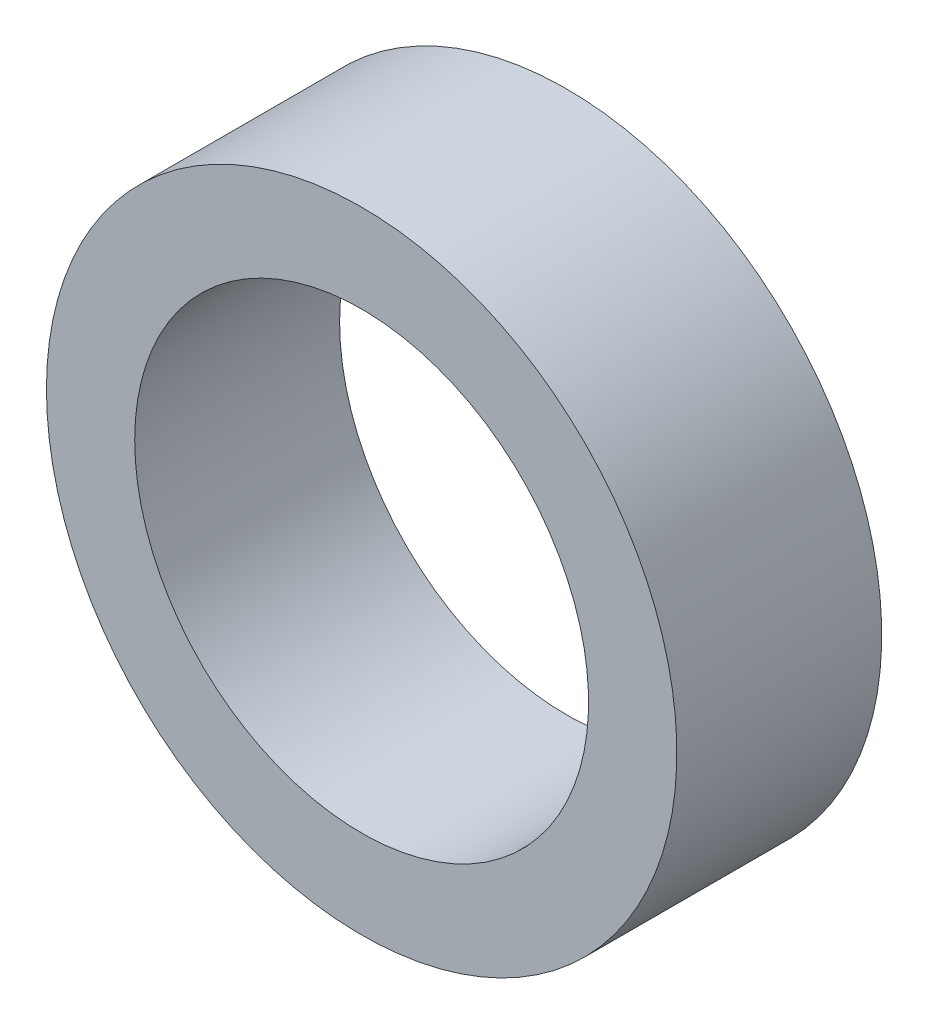
ISO-10303-21;
HEADER;
FILE_DESCRIPTION(('STEP AP214'),'2;1');
FILE_NAME('part.step','',(''),(''),'','','');
FILE_SCHEMA(('AUTOMOTIVE_DESIGN { 1 0 10303 214 1 1 1 1 }'));
ENDSEC;
DATA;
#1=APPLICATION_CONTEXT('core data for automotive mechanical design processes');
#2=APPLICATION_PROTOCOL_DEFINITION('international standard','automotive_design',2000,#1);
#3=PRODUCT_CONTEXT('',#1,'mechanical');
#4=PRODUCT('Part','Part','',(#3));
#5=PRODUCT_RELATED_PRODUCT_CATEGORY('part','',(#4));
#6=PRODUCT_DEFINITION_FORMATION('','',#4);
#7=PRODUCT_DEFINITION_CONTEXT('part definition',#1,'design');
#8=PRODUCT_DEFINITION('design','',#6,#7);
#9=PRODUCT_DEFINITION_SHAPE('','',#8);
#10=(LENGTH_UNIT() NAMED_UNIT(*) SI_UNIT(.MILLI.,.METRE.));
#11=(NAMED_UNIT(*) PLANE_ANGLE_UNIT() SI_UNIT($,.RADIAN.));
#12=(NAMED_UNIT(*) SI_UNIT($,.STERADIAN.) SOLID_ANGLE_UNIT());
#13=UNCERTAINTY_MEASURE_WITH_UNIT(LENGTH_MEASURE(1.E-05),#10,'distance_accuracy_value','');
#14=(GEOMETRIC_REPRESENTATION_CONTEXT(3) GLOBAL_UNCERTAINTY_ASSIGNED_CONTEXT((#13)) GLOBAL_UNIT_ASSIGNED_CONTEXT((#10,
#11,#12)) REPRESENTATION_CONTEXT('',''));
#15=CARTESIAN_POINT('',(0.,0.,0.));
#16=DIRECTION('',(0.,0.,1.));
#17=DIRECTION('',(1.,0.,0.));
#18=AXIS2_PLACEMENT_3D('',#15,#16,#17);
#19=CARTESIAN_POINT('',(0.,0.,1.625));
#20=DIRECTION('',(0.,0.,1.));
#21=DIRECTION('',(1.,0.,0.));
#22=AXIS2_PLACEMENT_3D('',#19,#20,#21);
#23=PLANE('',#22);
#24=CARTESIAN_POINT('',(0.,0.,1.625));
#25=DIRECTION('',(0.,0.,1.));
#26=DIRECTION('',(1.,0.,0.));
#27=AXIS2_PLACEMENT_3D('',#24,#25,#26);
#28=CIRCLE('',#27,5.);
#29=CARTESIAN_POINT('',(-5.,0.,1.625));
#30=VERTEX_POINT('',#29);
#31=EDGE_CURVE('E10',#30,#30,#28,.T.);
#32=ORIENTED_EDGE('',*,*,#31,.T.);
#33=EDGE_LOOP('',(#32));
#34=FACE_BOUND('',#33,.T.);
#35=CARTESIAN_POINT('',(0.,0.,1.625));
#36=DIRECTION('',(0.,0.,1.));
#37=DIRECTION('',(1.,0.,0.));
#38=AXIS2_PLACEMENT_3D('',#35,#36,#37);
#39=CIRCLE('',#38,3.6);
#40=CARTESIAN_POINT('',(-3.6,0.,1.625));
#41=VERTEX_POINT('',#40);
#42=EDGE_CURVE('E54',#41,#41,#39,.T.);
#43=ORIENTED_EDGE('',*,*,#42,.F.);
#44=EDGE_LOOP('',(#43));
#45=FACE_BOUND('',#44,.T.);
#46=ADVANCED_FACE('F41',(#34,#45),#23,.T.);
#47=CARTESIAN_POINT('',(0.,0.,-1.625));
#48=DIRECTION('',(0.,0.,1.));
#49=DIRECTION('',(1.,0.,0.));
#50=AXIS2_PLACEMENT_3D('',#47,#48,#49);
#51=PLANE('',#50);
#52=CARTESIAN_POINT('',(0.,0.,-1.625));
#53=DIRECTION('',(0.,0.,1.));
#54=DIRECTION('',(1.,0.,0.));
#55=AXIS2_PLACEMENT_3D('',#52,#53,#54);
#56=CIRCLE('',#55,5.);
#57=CARTESIAN_POINT('',(-5.,0.,-1.625));
#58=VERTEX_POINT('',#57);
#59=EDGE_CURVE('E45',#58,#58,#56,.T.);
#60=ORIENTED_EDGE('',*,*,#59,.F.);
#61=EDGE_LOOP('',(#60));
#62=FACE_BOUND('',#61,.T.);
#63=CARTESIAN_POINT('',(0.,0.,-1.625));
#64=DIRECTION('',(0.,0.,1.));
#65=DIRECTION('',(1.,0.,0.));
#66=AXIS2_PLACEMENT_3D('',#63,#64,#65);
#67=CIRCLE('',#66,3.6);
#68=CARTESIAN_POINT('',(-3.6,0.,-1.625));
#69=VERTEX_POINT('',#68);
#70=EDGE_CURVE('E56',#69,#69,#67,.T.);
#71=ORIENTED_EDGE('',*,*,#70,.T.);
#72=EDGE_LOOP('',(#71));
#73=FACE_BOUND('',#72,.T.);
#74=ADVANCED_FACE('F68',(#62,#73),#51,.F.);
#75=CARTESIAN_POINT('',(0.,0.,1.625));
#76=DIRECTION('',(0.,0.,-1.));
#77=DIRECTION('',(-1.,0.,0.));
#78=AXIS2_PLACEMENT_3D('',#75,#76,#77);
#79=CYLINDRICAL_SURFACE('',#78,5.);
#80=CARTESIAN_POINT('',(-5.,0.,1.625));
#81=CARTESIAN_POINT('',(-5.,0.,1.59114583333333));
#82=CARTESIAN_POINT('',(-5.,0.,1.55729166666667));
#83=CARTESIAN_POINT('',(-5.,0.,1.48958333333333));
#84=CARTESIAN_POINT('',(-5.,0.,1.45572916666667));
#85=CARTESIAN_POINT('',(-5.,0.,1.38802083333333));
#86=CARTESIAN_POINT('',(-5.,0.,1.35416666666667));
#87=CARTESIAN_POINT('',(-5.,0.,1.28645833333333));
#88=CARTESIAN_POINT('',(-5.,0.,1.25260416666667));
#89=CARTESIAN_POINT('',(-5.,0.,1.18489583333333));
#90=CARTESIAN_POINT('',(-5.,0.,1.15104166666667));
#91=CARTESIAN_POINT('',(-5.,0.,1.08333333333333));
#92=CARTESIAN_POINT('',(-5.,0.,1.04947916666667));
#93=CARTESIAN_POINT('',(-5.,0.,0.981770833333333));
#94=CARTESIAN_POINT('',(-5.,0.,0.947916666666666));
#95=CARTESIAN_POINT('',(-5.,0.,0.880208333333333));
#96=CARTESIAN_POINT('',(-5.,0.,0.846354166666667));
#97=CARTESIAN_POINT('',(-5.,0.,0.778645833333333));
#98=CARTESIAN_POINT('',(-5.,0.,0.744791666666667));
#99=CARTESIAN_POINT('',(-5.,0.,0.677083333333333));
#100=CARTESIAN_POINT('',(-5.,0.,0.643229166666667));
#101=CARTESIAN_POINT('',(-5.,0.,0.575520833333333));
#102=CARTESIAN_POINT('',(-5.,0.,0.541666666666666));
#103=CARTESIAN_POINT('',(-5.,0.,0.473958333333333));
#104=CARTESIAN_POINT('',(-5.,0.,0.440104166666666));
#105=CARTESIAN_POINT('',(-5.,0.,0.372395833333333));
#106=CARTESIAN_POINT('',(-5.,0.,0.338541666666666));
#107=CARTESIAN_POINT('',(-5.,0.,0.270833333333333));
#108=CARTESIAN_POINT('',(-5.,0.,0.236979166666666));
#109=CARTESIAN_POINT('',(-5.,0.,0.169270833333333));
#110=CARTESIAN_POINT('',(-5.,0.,0.135416666666666));
#111=CARTESIAN_POINT('',(-5.,0.,0.0677083333333332));
#112=CARTESIAN_POINT('',(-5.,0.,0.0338541666666665));
#113=CARTESIAN_POINT('',(-5.,0.,-0.0338541666666669));
#114=CARTESIAN_POINT('',(-5.,0.,-0.0677083333333336));
#115=CARTESIAN_POINT('',(-5.,0.,-0.135416666666667));
#116=CARTESIAN_POINT('',(-5.,0.,-0.169270833333334));
#117=CARTESIAN_POINT('',(-5.,0.,-0.236979166666667));
#118=CARTESIAN_POINT('',(-5.,0.,-0.270833333333334));
#119=CARTESIAN_POINT('',(-5.,0.,-0.338541666666667));
#120=CARTESIAN_POINT('',(-5.,0.,-0.372395833333333));
#121=CARTESIAN_POINT('',(-5.,0.,-0.440104166666666));
#122=CARTESIAN_POINT('',(-5.,0.,-0.473958333333333));
#123=CARTESIAN_POINT('',(-5.,0.,-0.541666666666667));
#124=CARTESIAN_POINT('',(-5.,0.,-0.575520833333333));
#125=CARTESIAN_POINT('',(-5.,0.,-0.643229166666667));
#126=CARTESIAN_POINT('',(-5.,0.,-0.677083333333333));
#127=CARTESIAN_POINT('',(-5.,0.,-0.744791666666667));
#128=CARTESIAN_POINT('',(-5.,0.,-0.778645833333333));
#129=CARTESIAN_POINT('',(-5.,0.,-0.846354166666667));
#130=CARTESIAN_POINT('',(-5.,0.,-0.880208333333333));
#131=CARTESIAN_POINT('',(-5.,0.,-0.947916666666666));
#132=CARTESIAN_POINT('',(-5.,0.,-0.981770833333333));
#133=CARTESIAN_POINT('',(-5.,0.,-1.04947916666667));
#134=CARTESIAN_POINT('',(-5.,0.,-1.08333333333333));
#135=CARTESIAN_POINT('',(-5.,0.,-1.15104166666667));
#136=CARTESIAN_POINT('',(-5.,0.,-1.18489583333333));
#137=CARTESIAN_POINT('',(-5.,0.,-1.25260416666667));
#138=CARTESIAN_POINT('',(-5.,0.,-1.28645833333333));
#139=CARTESIAN_POINT('',(-5.,0.,-1.35416666666667));
#140=CARTESIAN_POINT('',(-5.,0.,-1.38802083333333));
#141=CARTESIAN_POINT('',(-5.,0.,-1.45572916666667));
#142=CARTESIAN_POINT('',(-5.,0.,-1.48958333333333));
#143=CARTESIAN_POINT('',(-5.,0.,-1.55729166666667));
#144=CARTESIAN_POINT('',(-5.,0.,-1.59114583333333));
#145=CARTESIAN_POINT('',(-5.,0.,-1.625));
#146=B_SPLINE_CURVE_WITH_KNOTS('',3,(#80,#81,#82,#83,#84,#85,#86,#87,#88,#89,#90,#91,#92,#93,
#94,#95,#96,#97,#98,#99,#100,#101,#102,#103,#104,#105,#106,#107,#108,#109,#110,#111,#112,#113,
#114,#115,#116,#117,#118,#119,#120,#121,#122,#123,#124,#125,#126,#127,#128,#129,#130,#131,#132,
#133,#134,#135,#136,#137,#138,#139,#140,#141,#142,#143,#144,#145),.UNSPECIFIED.,.F.,.F.,(4,2,2,
2,2,2,2,2,2,2,2,2,2,2,2,2,2,2,2,2,2,2,2,2,2,2,2,2,2,2,2,2,4),(0.,0.1015625,0.203125,0.3046875,
0.40625,0.5078125,0.609375,0.7109375,0.8125,0.9140625,1.015625,1.1171875,1.21875,1.3203125,
1.421875,1.5234375,1.625,1.7265625,1.828125,1.9296875,2.03125,2.1328125,2.234375,2.3359375,
2.4375,2.5390625,2.640625,2.7421875,2.84375,2.9453125,3.046875,3.1484375,3.25),.UNSPECIFIED.);
#147=EDGE_CURVE('BSEAM43',#30,#58,#146,.T.);
#148=ORIENTED_EDGE('',*,*,#31,.F.);
#149=ORIENTED_EDGE('',*,*,#59,.T.);
#150=ORIENTED_EDGE('',*,*,#147,.T.);
#151=ORIENTED_EDGE('',*,*,#147,.F.);
#152=EDGE_LOOP('',(#148,#150,#149,#151));
#153=FACE_BOUND('',#152,.T.);
#154=ADVANCED_FACE('F43',(#153),#79,.T.);
#155=CARTESIAN_POINT('',(0.,0.,1.625));
#156=DIRECTION('',(0.,0.,-1.));
#157=DIRECTION('',(-1.,0.,0.));
#158=AXIS2_PLACEMENT_3D('',#155,#156,#157);
#159=CYLINDRICAL_SURFACE('',#158,3.6);
#160=CARTESIAN_POINT('',(-3.6,0.,1.625));
#161=CARTESIAN_POINT('',(-3.6,0.,1.59114583333333));
#162=CARTESIAN_POINT('',(-3.6,0.,1.55729166666667));
#163=CARTESIAN_POINT('',(-3.6,0.,1.48958333333333));
#164=CARTESIAN_POINT('',(-3.6,0.,1.45572916666667));
#165=CARTESIAN_POINT('',(-3.6,0.,1.38802083333333));
#166=CARTESIAN_POINT('',(-3.6,0.,1.35416666666667));
#167=CARTESIAN_POINT('',(-3.6,0.,1.28645833333333));
#168=CARTESIAN_POINT('',(-3.6,0.,1.25260416666667));
#169=CARTESIAN_POINT('',(-3.6,0.,1.18489583333333));
#170=CARTESIAN_POINT('',(-3.6,0.,1.15104166666667));
#171=CARTESIAN_POINT('',(-3.6,0.,1.08333333333333));
#172=CARTESIAN_POINT('',(-3.6,0.,1.04947916666667));
#173=CARTESIAN_POINT('',(-3.6,0.,0.981770833333333));
#174=CARTESIAN_POINT('',(-3.6,0.,0.947916666666666));
#175=CARTESIAN_POINT('',(-3.6,0.,0.880208333333333));
#176=CARTESIAN_POINT('',(-3.6,0.,0.846354166666667));
#177=CARTESIAN_POINT('',(-3.6,0.,0.778645833333333));
#178=CARTESIAN_POINT('',(-3.6,0.,0.744791666666667));
#179=CARTESIAN_POINT('',(-3.6,0.,0.677083333333333));
#180=CARTESIAN_POINT('',(-3.6,0.,0.643229166666667));
#181=CARTESIAN_POINT('',(-3.6,0.,0.575520833333333));
#182=CARTESIAN_POINT('',(-3.6,0.,0.541666666666667));
#183=CARTESIAN_POINT('',(-3.6,0.,0.473958333333333));
#184=CARTESIAN_POINT('',(-3.6,0.,0.440104166666667));
#185=CARTESIAN_POINT('',(-3.6,0.,0.372395833333333));
#186=CARTESIAN_POINT('',(-3.6,0.,0.338541666666667));
#187=CARTESIAN_POINT('',(-3.6,0.,0.270833333333333));
#188=CARTESIAN_POINT('',(-3.6,0.,0.236979166666667));
#189=CARTESIAN_POINT('',(-3.6,0.,0.169270833333333));
#190=CARTESIAN_POINT('',(-3.6,0.,0.135416666666667));
#191=CARTESIAN_POINT('',(-3.6,0.,0.0677083333333334));
#192=CARTESIAN_POINT('',(-3.6,0.,0.0338541666666667));
#193=CARTESIAN_POINT('',(-3.6,0.,-0.0338541666666667));
#194=CARTESIAN_POINT('',(-3.6,0.,-0.0677083333333334));
#195=CARTESIAN_POINT('',(-3.6,0.,-0.135416666666667));
#196=CARTESIAN_POINT('',(-3.6,0.,-0.169270833333333));
#197=CARTESIAN_POINT('',(-3.6,0.,-0.236979166666667));
#198=CARTESIAN_POINT('',(-3.6,0.,-0.270833333333333));
#199=CARTESIAN_POINT('',(-3.6,0.,-0.338541666666667));
#200=CARTESIAN_POINT('',(-3.6,0.,-0.372395833333333));
#201=CARTESIAN_POINT('',(-3.6,0.,-0.440104166666666));
#202=CARTESIAN_POINT('',(-3.6,0.,-0.473958333333333));
#203=CARTESIAN_POINT('',(-3.6,0.,-0.541666666666667));
#204=CARTESIAN_POINT('',(-3.6,0.,-0.575520833333333));
#205=CARTESIAN_POINT('',(-3.6,0.,-0.643229166666667));
#206=CARTESIAN_POINT('',(-3.6,0.,-0.677083333333333));
#207=CARTESIAN_POINT('',(-3.6,0.,-0.744791666666667));
#208=CARTESIAN_POINT('',(-3.6,0.,-0.778645833333333));
#209=CARTESIAN_POINT('',(-3.6,0.,-0.846354166666667));
#210=CARTESIAN_POINT('',(-3.6,0.,-0.880208333333333));
#211=CARTESIAN_POINT('',(-3.6,0.,-0.947916666666666));
#212=CARTESIAN_POINT('',(-3.6,0.,-0.981770833333333));
#213=CARTESIAN_POINT('',(-3.6,0.,-1.04947916666667));
#214=CARTESIAN_POINT('',(-3.6,0.,-1.08333333333333));
#215=CARTESIAN_POINT('',(-3.6,0.,-1.15104166666667));
#216=CARTESIAN_POINT('',(-3.6,0.,-1.18489583333333));
#217=CARTESIAN_POINT('',(-3.6,0.,-1.25260416666667));
#218=CARTESIAN_POINT('',(-3.6,0.,-1.28645833333333));
#219=CARTESIAN_POINT('',(-3.6,0.,-1.35416666666667));
#220=CARTESIAN_POINT('',(-3.6,0.,-1.38802083333333));
#221=CARTESIAN_POINT('',(-3.6,0.,-1.45572916666667));
#222=CARTESIAN_POINT('',(-3.6,0.,-1.48958333333333));
#223=CARTESIAN_POINT('',(-3.6,0.,-1.55729166666667));
#224=CARTESIAN_POINT('',(-3.6,0.,-1.59114583333333));
#225=CARTESIAN_POINT('',(-3.6,0.,-1.625));
#226=B_SPLINE_CURVE_WITH_KNOTS('',3,(#160,#161,#162,#163,#164,#165,#166,#167,#168,#169,#170,
#171,#172,#173,#174,#175,#176,#177,#178,#179,#180,#181,#182,#183,#184,#185,#186,#187,#188,#189,
#190,#191,#192,#193,#194,#195,#196,#197,#198,#199,#200,#201,#202,#203,#204,#205,#206,#207,#208,
#209,#210,#211,#212,#213,#214,#215,#216,#217,#218,#219,#220,#221,#222,#223,#224,#225),
.UNSPECIFIED.,.F.,.F.,(4,2,2,2,2,2,2,2,2,2,2,2,2,2,2,2,2,2,2,2,2,2,2,2,2,2,2,2,2,2,2,2,4),(0.,
0.1015625,0.203125,0.3046875,0.40625,0.5078125,0.609375,0.7109375,0.8125,0.9140625,1.015625,
1.1171875,1.21875,1.3203125,1.421875,1.5234375,1.625,1.7265625,1.828125,1.9296875,2.03125,
2.1328125,2.234375,2.3359375,2.4375,2.5390625,2.640625,2.7421875,2.84375,2.9453125,3.046875,
3.1484375,3.25),.UNSPECIFIED.);
#227=EDGE_CURVE('BSEAM64',#41,#69,#226,.T.);
#228=ORIENTED_EDGE('',*,*,#42,.T.);
#229=ORIENTED_EDGE('',*,*,#70,.F.);
#230=ORIENTED_EDGE('',*,*,#227,.T.);
#231=ORIENTED_EDGE('',*,*,#227,.F.);
#232=EDGE_LOOP('',(#228,#230,#229,#231));
#233=FACE_BOUND('',#232,.T.);
#234=ADVANCED_FACE('F64',(#233),#159,.F.);
#235=CLOSED_SHELL('',(#46,#74,#154,#234));
#236=MANIFOLD_SOLID_BREP('B2',#235);
#237=ADVANCED_BREP_SHAPE_REPRESENTATION('',(#18,#236),#14);
#238=SHAPE_DEFINITION_REPRESENTATION(#9,#237);
ENDSEC;
END-ISO-10303-21;
